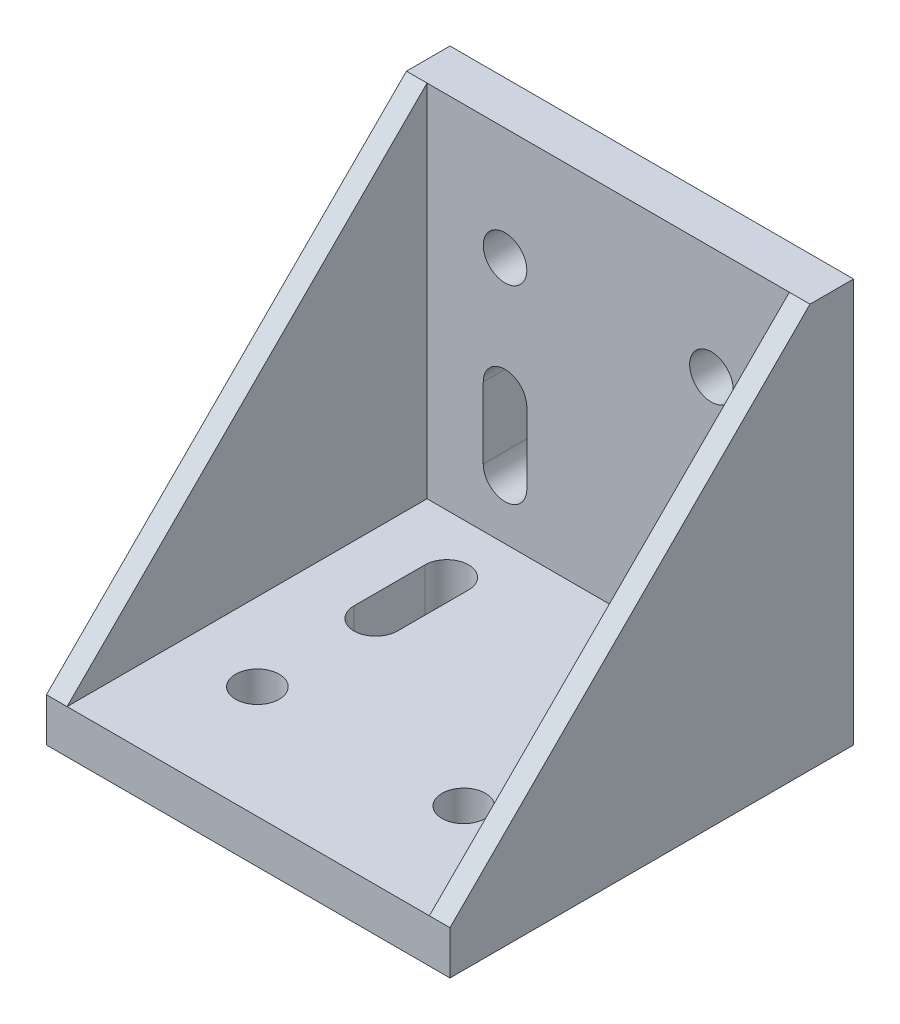
ISO-10303-21;
HEADER;
FILE_DESCRIPTION(('STEP AP214'),'2;1');
FILE_NAME('part.step','',(''),(''),'','','');
FILE_SCHEMA(('AUTOMOTIVE_DESIGN { 1 0 10303 214 1 1 1 1 }'));
ENDSEC;
DATA;
#1=APPLICATION_CONTEXT('core data for automotive mechanical design processes');
#2=APPLICATION_PROTOCOL_DEFINITION('international standard','automotive_design',2000,#1);
#3=PRODUCT_CONTEXT('',#1,'mechanical');
#4=PRODUCT('Part','Part','',(#3));
#5=PRODUCT_RELATED_PRODUCT_CATEGORY('part','',(#4));
#6=PRODUCT_DEFINITION_FORMATION('','',#4);
#7=PRODUCT_DEFINITION_CONTEXT('part definition',#1,'design');
#8=PRODUCT_DEFINITION('design','',#6,#7);
#9=PRODUCT_DEFINITION_SHAPE('','',#8);
#10=(LENGTH_UNIT() NAMED_UNIT(*) SI_UNIT(.MILLI.,.METRE.));
#11=(NAMED_UNIT(*) PLANE_ANGLE_UNIT() SI_UNIT($,.RADIAN.));
#12=(NAMED_UNIT(*) SI_UNIT($,.STERADIAN.) SOLID_ANGLE_UNIT());
#13=UNCERTAINTY_MEASURE_WITH_UNIT(LENGTH_MEASURE(1.E-05),#10,'distance_accuracy_value','');
#14=(GEOMETRIC_REPRESENTATION_CONTEXT(3) GLOBAL_UNCERTAINTY_ASSIGNED_CONTEXT((#13)) GLOBAL_UNIT_ASSIGNED_CONTEXT((#10,
#11,#12)) REPRESENTATION_CONTEXT('',''));
#15=CARTESIAN_POINT('',(0.,0.,0.));
#16=DIRECTION('',(0.,0.,1.));
#17=DIRECTION('',(1.,0.,0.));
#18=AXIS2_PLACEMENT_3D('',#15,#16,#17);
#19=CARTESIAN_POINT('',(44.,-44.,9.5));
#20=DIRECTION('',(0.,0.,1.));
#21=DIRECTION('',(1.,0.,0.));
#22=AXIS2_PLACEMENT_3D('',#19,#20,#21);
#23=PLANE('',#22);
#24=DIRECTION('',(0.,1.,0.));
#25=VECTOR('',#24,1.);
#26=CARTESIAN_POINT('',(-27.25,-6.30000000000004,9.50000000000002));
#27=LINE('',#26,#25);
#28=CARTESIAN_POINT('',(-27.25,-21.8,9.50000000000002));
#29=VERTEX_POINT('',#28);
#30=CARTESIAN_POINT('',(-27.25,-6.30000000000004,9.5));
#31=VERTEX_POINT('',#30);
#32=EDGE_CURVE('E224',#29,#31,#27,.T.);
#33=ORIENTED_EDGE('',*,*,#32,.T.);
#34=CARTESIAN_POINT('',(-22.5,-6.30000000000004,9.50000000000002));
#35=DIRECTION('',(0.,0.,-1.));
#36=DIRECTION('',(0.,-1.,0.));
#37=AXIS2_PLACEMENT_3D('',#34,#35,#36);
#38=CIRCLE('',#37,4.75);
#39=CARTESIAN_POINT('',(-17.75,-6.30000000000003,9.50000000000002));
#40=VERTEX_POINT('',#39);
#41=EDGE_CURVE('E49',#31,#40,#38,.T.);
#42=ORIENTED_EDGE('',*,*,#41,.T.);
#43=DIRECTION('',(0.,-1.,0.));
#44=VECTOR('',#43,1.);
#45=CARTESIAN_POINT('',(-17.75,-6.30000000000003,9.50000000000002));
#46=LINE('',#45,#44);
#47=CARTESIAN_POINT('',(-17.75,-21.8,9.50000000000002));
#48=VERTEX_POINT('',#47);
#49=EDGE_CURVE('E212',#40,#48,#46,.T.);
#50=ORIENTED_EDGE('',*,*,#49,.T.);
#51=CARTESIAN_POINT('',(-22.5,-21.8,9.50000000000002));
#52=DIRECTION('',(0.,0.,-1.));
#53=DIRECTION('',(0.,-1.,0.));
#54=AXIS2_PLACEMENT_3D('',#51,#52,#53);
#55=CIRCLE('',#54,4.75);
#56=EDGE_CURVE('E215',#48,#29,#55,.T.);
#57=ORIENTED_EDGE('',*,*,#56,.T.);
#58=EDGE_LOOP('',(#33,#42,#50,#57));
#59=FACE_BOUND('',#58,.T.);
#60=CARTESIAN_POINT('',(22.5,19.5,9.50000000000003));
#61=DIRECTION('',(0.,0.,-1.));
#62=DIRECTION('',(0.,1.,0.));
#63=AXIS2_PLACEMENT_3D('',#60,#61,#62);
#64=CIRCLE('',#63,4.75000000000001);
#65=CARTESIAN_POINT('',(22.5,24.25,9.50000000000003));
#66=VERTEX_POINT('',#65);
#67=EDGE_CURVE('E259',#66,#66,#64,.T.);
#68=ORIENTED_EDGE('',*,*,#67,.T.);
#69=EDGE_LOOP('',(#68));
#70=FACE_BOUND('',#69,.T.);
#71=DIRECTION('',(-1.,0.,0.));
#72=VECTOR('',#71,1.);
#73=CARTESIAN_POINT('',(44.,-34.5,9.5));
#74=LINE('',#73,#72);
#75=CARTESIAN_POINT('',(39.5,-34.5,9.5));
#76=VERTEX_POINT('',#75);
#77=CARTESIAN_POINT('',(-39.5,-34.5,9.5));
#78=VERTEX_POINT('',#77);
#79=EDGE_CURVE('E389',#76,#78,#74,.T.);
#80=ORIENTED_EDGE('',*,*,#79,.F.);
#81=DIRECTION('',(0.,-1.,0.));
#82=VECTOR('',#81,1.);
#83=CARTESIAN_POINT('',(39.5,-34.5,9.5));
#84=LINE('',#83,#82);
#85=CARTESIAN_POINT('',(39.5,44.,9.5));
#86=VERTEX_POINT('',#85);
#87=EDGE_CURVE('E348',#86,#76,#84,.T.);
#88=ORIENTED_EDGE('',*,*,#87,.F.);
#89=DIRECTION('',(-1.,0.,0.));
#90=VECTOR('',#89,1.);
#91=CARTESIAN_POINT('',(-44.,44.,9.5));
#92=LINE('',#91,#90);
#93=CARTESIAN_POINT('',(-39.5,44.,9.5));
#94=VERTEX_POINT('',#93);
#95=EDGE_CURVE('E396',#86,#94,#92,.T.);
#96=ORIENTED_EDGE('',*,*,#95,.T.);
#97=DIRECTION('',(0.,-1.,0.));
#98=VECTOR('',#97,1.);
#99=CARTESIAN_POINT('',(-39.5,-34.5,9.5));
#100=LINE('',#99,#98);
#101=EDGE_CURVE('E363',#94,#78,#100,.T.);
#102=ORIENTED_EDGE('',*,*,#101,.T.);
#103=EDGE_LOOP('',(#80,#88,#96,#102));
#104=FACE_BOUND('',#103,.T.);
#105=DIRECTION('',(0.,1.,0.));
#106=VECTOR('',#105,1.);
#107=CARTESIAN_POINT('',(17.75,-6.30000000000003,9.50000000000002));
#108=LINE('',#107,#106);
#109=CARTESIAN_POINT('',(17.75,-21.8,9.50000000000002));
#110=VERTEX_POINT('',#109);
#111=CARTESIAN_POINT('',(17.75,-6.30000000000003,9.5));
#112=VERTEX_POINT('',#111);
#113=EDGE_CURVE('E248',#110,#112,#108,.T.);
#114=ORIENTED_EDGE('',*,*,#113,.T.);
#115=CARTESIAN_POINT('',(22.5,-6.30000000000003,9.50000000000002));
#116=DIRECTION('',(0.,0.,-1.));
#117=DIRECTION('',(0.,1.,0.));
#118=AXIS2_PLACEMENT_3D('',#115,#116,#117);
#119=CIRCLE('',#118,4.75);
#120=CARTESIAN_POINT('',(27.25,-6.30000000000003,9.50000000000002));
#121=VERTEX_POINT('',#120);
#122=EDGE_CURVE('E231',#112,#121,#119,.T.);
#123=ORIENTED_EDGE('',*,*,#122,.T.);
#124=DIRECTION('',(0.,-1.,0.));
#125=VECTOR('',#124,1.);
#126=CARTESIAN_POINT('',(27.25,-6.30000000000003,9.50000000000002));
#127=LINE('',#126,#125);
#128=CARTESIAN_POINT('',(27.25,-21.8,9.50000000000002));
#129=VERTEX_POINT('',#128);
#130=EDGE_CURVE('E238',#121,#129,#127,.T.);
#131=ORIENTED_EDGE('',*,*,#130,.T.);
#132=CARTESIAN_POINT('',(22.5,-21.8,9.50000000000002));
#133=DIRECTION('',(0.,0.,-1.));
#134=DIRECTION('',(0.,1.,0.));
#135=AXIS2_PLACEMENT_3D('',#132,#133,#134);
#136=CIRCLE('',#135,4.75);
#137=EDGE_CURVE('E251',#129,#110,#136,.T.);
#138=ORIENTED_EDGE('',*,*,#137,.T.);
#139=EDGE_LOOP('',(#114,#123,#131,#138));
#140=FACE_BOUND('',#139,.T.);
#141=CARTESIAN_POINT('',(-22.5,19.5,9.50000000000003));
#142=DIRECTION('',(0.,0.,-1.));
#143=DIRECTION('',(0.,-1.,0.));
#144=AXIS2_PLACEMENT_3D('',#141,#142,#143);
#145=CIRCLE('',#144,4.75000000000001);
#146=CARTESIAN_POINT('',(-22.5,14.75,9.50000000000003));
#147=VERTEX_POINT('',#146);
#148=EDGE_CURVE('E218',#147,#147,#145,.T.);
#149=ORIENTED_EDGE('',*,*,#148,.T.);
#150=EDGE_LOOP('',(#149));
#151=FACE_BOUND('',#150,.T.);
#152=ADVANCED_FACE('F34',(#59,#70,#104,#140,#151),#23,.T.);
#153=CARTESIAN_POINT('',(44.,-44.,0.));
#154=DIRECTION('',(0.,0.,1.));
#155=DIRECTION('',(1.,0.,0.));
#156=AXIS2_PLACEMENT_3D('',#153,#154,#155);
#157=PLANE('',#156);
#158=CARTESIAN_POINT('',(-22.5,-6.30000000000004,0.));
#159=DIRECTION('',(0.,0.,-1.));
#160=DIRECTION('',(0.,-1.,0.));
#161=AXIS2_PLACEMENT_3D('',#158,#159,#160);
#162=CIRCLE('',#161,4.75);
#163=CARTESIAN_POINT('',(-27.25,-6.30000000000004,0.));
#164=VERTEX_POINT('',#163);
#165=CARTESIAN_POINT('',(-17.75,-6.30000000000002,0.));
#166=VERTEX_POINT('',#165);
#167=EDGE_CURVE('E203',#164,#166,#162,.T.);
#168=ORIENTED_EDGE('',*,*,#167,.F.);
#169=DIRECTION('',(0.,1.,0.));
#170=VECTOR('',#169,1.);
#171=CARTESIAN_POINT('',(-27.25,-6.30000000000004,0.));
#172=LINE('',#171,#170);
#173=CARTESIAN_POINT('',(-27.25,-21.8,0.));
#174=VERTEX_POINT('',#173);
#175=EDGE_CURVE('E195',#174,#164,#172,.T.);
#176=ORIENTED_EDGE('',*,*,#175,.F.);
#177=CARTESIAN_POINT('',(-22.5,-21.8,0.));
#178=DIRECTION('',(0.,0.,-1.));
#179=DIRECTION('',(0.,-1.,0.));
#180=AXIS2_PLACEMENT_3D('',#177,#178,#179);
#181=CIRCLE('',#180,4.75);
#182=CARTESIAN_POINT('',(-17.75,-21.8,0.));
#183=VERTEX_POINT('',#182);
#184=EDGE_CURVE('E202',#183,#174,#181,.T.);
#185=ORIENTED_EDGE('',*,*,#184,.F.);
#186=DIRECTION('',(0.,-1.,0.));
#187=VECTOR('',#186,1.);
#188=CARTESIAN_POINT('',(-17.75,-6.30000000000002,0.));
#189=LINE('',#188,#187);
#190=EDGE_CURVE('E207',#166,#183,#189,.T.);
#191=ORIENTED_EDGE('',*,*,#190,.F.);
#192=EDGE_LOOP('',(#168,#176,#185,#191));
#193=FACE_BOUND('',#192,.T.);
#194=CARTESIAN_POINT('',(22.5,19.5,0.));
#195=DIRECTION('',(0.,0.,-1.));
#196=DIRECTION('',(0.,1.,0.));
#197=AXIS2_PLACEMENT_3D('',#194,#195,#196);
#198=CIRCLE('',#197,4.75000000000001);
#199=CARTESIAN_POINT('',(22.5,24.25,0.));
#200=VERTEX_POINT('',#199);
#201=EDGE_CURVE('E266',#200,#200,#198,.T.);
#202=ORIENTED_EDGE('',*,*,#201,.F.);
#203=EDGE_LOOP('',(#202));
#204=FACE_BOUND('',#203,.T.);
#205=DIRECTION('',(-1.,0.,0.));
#206=VECTOR('',#205,1.);
#207=CARTESIAN_POINT('',(-44.,44.,0.));
#208=LINE('',#207,#206);
#209=CARTESIAN_POINT('',(44.,44.,0.));
#210=VERTEX_POINT('',#209);
#211=CARTESIAN_POINT('',(-44.,44.,0.));
#212=VERTEX_POINT('',#211);
#213=EDGE_CURVE('E398',#210,#212,#208,.T.);
#214=ORIENTED_EDGE('',*,*,#213,.F.);
#215=DIRECTION('',(0.,1.,0.));
#216=VECTOR('',#215,1.);
#217=CARTESIAN_POINT('',(44.,44.,0.));
#218=LINE('',#217,#216);
#219=CARTESIAN_POINT('',(44.,-44.,0.));
#220=VERTEX_POINT('',#219);
#221=EDGE_CURVE('E391',#220,#210,#218,.T.);
#222=ORIENTED_EDGE('',*,*,#221,.F.);
#223=DIRECTION('',(1.,0.,0.));
#224=VECTOR('',#223,1.);
#225=CARTESIAN_POINT('',(-44.,-44.,0.));
#226=LINE('',#225,#224);
#227=CARTESIAN_POINT('',(-44.,-44.,0.));
#228=VERTEX_POINT('',#227);
#229=EDGE_CURVE('E402',#228,#220,#226,.T.);
#230=ORIENTED_EDGE('',*,*,#229,.F.);
#231=DIRECTION('',(0.,-1.,0.));
#232=VECTOR('',#231,1.);
#233=CARTESIAN_POINT('',(-44.,44.,0.));
#234=LINE('',#233,#232);
#235=EDGE_CURVE('E400',#212,#228,#234,.T.);
#236=ORIENTED_EDGE('',*,*,#235,.F.);
#237=EDGE_LOOP('',(#214,#222,#230,#236));
#238=FACE_BOUND('',#237,.T.);
#239=CARTESIAN_POINT('',(22.5,-6.30000000000002,0.));
#240=DIRECTION('',(0.,0.,-1.));
#241=DIRECTION('',(0.,1.,0.));
#242=AXIS2_PLACEMENT_3D('',#239,#240,#241);
#243=CIRCLE('',#242,4.75);
#244=CARTESIAN_POINT('',(17.75,-6.30000000000002,0.));
#245=VERTEX_POINT('',#244);
#246=CARTESIAN_POINT('',(27.25,-6.30000000000002,0.));
#247=VERTEX_POINT('',#246);
#248=EDGE_CURVE('E235',#245,#247,#243,.T.);
#249=ORIENTED_EDGE('',*,*,#248,.F.);
#250=DIRECTION('',(0.,1.,0.));
#251=VECTOR('',#250,1.);
#252=CARTESIAN_POINT('',(17.75,-6.30000000000002,0.));
#253=LINE('',#252,#251);
#254=CARTESIAN_POINT('',(17.75,-21.8,0.));
#255=VERTEX_POINT('',#254);
#256=EDGE_CURVE('E237',#255,#245,#253,.T.);
#257=ORIENTED_EDGE('',*,*,#256,.F.);
#258=CARTESIAN_POINT('',(22.5,-21.8,0.));
#259=DIRECTION('',(0.,0.,-1.));
#260=DIRECTION('',(0.,1.,0.));
#261=AXIS2_PLACEMENT_3D('',#258,#259,#260);
#262=CIRCLE('',#261,4.75);
#263=CARTESIAN_POINT('',(27.25,-21.8,0.));
#264=VERTEX_POINT('',#263);
#265=EDGE_CURVE('E240',#264,#255,#262,.T.);
#266=ORIENTED_EDGE('',*,*,#265,.F.);
#267=DIRECTION('',(0.,-1.,0.));
#268=VECTOR('',#267,1.);
#269=CARTESIAN_POINT('',(27.25,-6.30000000000002,0.));
#270=LINE('',#269,#268);
#271=EDGE_CURVE('E243',#247,#264,#270,.T.);
#272=ORIENTED_EDGE('',*,*,#271,.F.);
#273=EDGE_LOOP('',(#249,#257,#266,#272));
#274=FACE_BOUND('',#273,.T.);
#275=CARTESIAN_POINT('',(-22.5,19.5,0.));
#276=DIRECTION('',(0.,0.,-1.));
#277=DIRECTION('',(0.,-1.,0.));
#278=AXIS2_PLACEMENT_3D('',#275,#276,#277);
#279=CIRCLE('',#278,4.75000000000001);
#280=CARTESIAN_POINT('',(-22.5,14.75,0.));
#281=VERTEX_POINT('',#280);
#282=EDGE_CURVE('E225',#281,#281,#279,.T.);
#283=ORIENTED_EDGE('',*,*,#282,.F.);
#284=EDGE_LOOP('',(#283));
#285=FACE_BOUND('',#284,.T.);
#286=ADVANCED_FACE('F210',(#193,#204,#238,#274,#285),#157,.F.);
#287=CARTESIAN_POINT('',(44.,-34.5,88.));
#288=DIRECTION('',(0.,1.,0.));
#289=DIRECTION('',(0.,0.,1.));
#290=AXIS2_PLACEMENT_3D('',#287,#288,#289);
#291=PLANE('',#290);
#292=CARTESIAN_POINT('',(-22.5,-34.5,63.5));
#293=DIRECTION('',(0.,1.,0.));
#294=DIRECTION('',(0.,0.,-1.));
#295=AXIS2_PLACEMENT_3D('',#292,#293,#294);
#296=CIRCLE('',#295,4.75000000000001);
#297=CARTESIAN_POINT('',(-22.5,-34.5,58.75));
#298=VERTEX_POINT('',#297);
#299=EDGE_CURVE('E269',#298,#298,#296,.T.);
#300=ORIENTED_EDGE('',*,*,#299,.F.);
#301=EDGE_LOOP('',(#300));
#302=FACE_BOUND('',#301,.T.);
#303=CARTESIAN_POINT('',(-22.5,-34.5,37.7));
#304=DIRECTION('',(0.,1.,0.));
#305=DIRECTION('',(0.,0.,-1.));
#306=AXIS2_PLACEMENT_3D('',#303,#304,#305);
#307=CIRCLE('',#306,4.75);
#308=CARTESIAN_POINT('',(-27.25,-34.5,37.7));
#309=VERTEX_POINT('',#308);
#310=CARTESIAN_POINT('',(-17.75,-34.5,37.7));
#311=VERTEX_POINT('',#310);
#312=EDGE_CURVE('E275',#309,#311,#307,.T.);
#313=ORIENTED_EDGE('',*,*,#312,.F.);
#314=DIRECTION('',(0.,0.,1.));
#315=VECTOR('',#314,1.);
#316=CARTESIAN_POINT('',(-27.25,-34.5,37.7));
#317=LINE('',#316,#315);
#318=CARTESIAN_POINT('',(-27.25,-34.5,22.2));
#319=VERTEX_POINT('',#318);
#320=EDGE_CURVE('E282',#319,#309,#317,.T.);
#321=ORIENTED_EDGE('',*,*,#320,.F.);
#322=CARTESIAN_POINT('',(-22.5,-34.5,22.2));
#323=DIRECTION('',(0.,1.,0.));
#324=DIRECTION('',(0.,0.,-1.));
#325=AXIS2_PLACEMENT_3D('',#322,#323,#324);
#326=CIRCLE('',#325,4.75);
#327=CARTESIAN_POINT('',(-17.75,-34.5,22.2));
#328=VERTEX_POINT('',#327);
#329=EDGE_CURVE('E296',#328,#319,#326,.T.);
#330=ORIENTED_EDGE('',*,*,#329,.F.);
#331=DIRECTION('',(0.,0.,-1.));
#332=VECTOR('',#331,1.);
#333=CARTESIAN_POINT('',(-17.75,-34.5,37.7));
#334=LINE('',#333,#332);
#335=EDGE_CURVE('E293',#311,#328,#334,.T.);
#336=ORIENTED_EDGE('',*,*,#335,.F.);
#337=EDGE_LOOP('',(#313,#321,#330,#336));
#338=FACE_BOUND('',#337,.T.);
#339=CARTESIAN_POINT('',(22.5,-34.5,37.7));
#340=DIRECTION('',(0.,1.,0.));
#341=DIRECTION('',(0.,0.,1.));
#342=AXIS2_PLACEMENT_3D('',#339,#340,#341);
#343=CIRCLE('',#342,4.75);
#344=CARTESIAN_POINT('',(17.75,-34.5,37.7));
#345=VERTEX_POINT('',#344);
#346=CARTESIAN_POINT('',(27.25,-34.5,37.7));
#347=VERTEX_POINT('',#346);
#348=EDGE_CURVE('E303',#345,#347,#343,.T.);
#349=ORIENTED_EDGE('',*,*,#348,.F.);
#350=DIRECTION('',(0.,0.,1.));
#351=VECTOR('',#350,1.);
#352=CARTESIAN_POINT('',(17.75,-34.5,37.7));
#353=LINE('',#352,#351);
#354=CARTESIAN_POINT('',(17.75,-34.5,22.2));
#355=VERTEX_POINT('',#354);
#356=EDGE_CURVE('E314',#355,#345,#353,.T.);
#357=ORIENTED_EDGE('',*,*,#356,.F.);
#358=CARTESIAN_POINT('',(22.5,-34.5,22.2));
#359=DIRECTION('',(0.,1.,0.));
#360=DIRECTION('',(0.,0.,1.));
#361=AXIS2_PLACEMENT_3D('',#358,#359,#360);
#362=CIRCLE('',#361,4.75);
#363=CARTESIAN_POINT('',(27.25,-34.5,22.2));
#364=VERTEX_POINT('',#363);
#365=EDGE_CURVE('E328',#364,#355,#362,.T.);
#366=ORIENTED_EDGE('',*,*,#365,.F.);
#367=DIRECTION('',(0.,0.,-1.));
#368=VECTOR('',#367,1.);
#369=CARTESIAN_POINT('',(27.25,-34.5,37.7));
#370=LINE('',#369,#368);
#371=EDGE_CURVE('E325',#347,#364,#370,.T.);
#372=ORIENTED_EDGE('',*,*,#371,.F.);
#373=EDGE_LOOP('',(#349,#357,#366,#372));
#374=FACE_BOUND('',#373,.T.);
#375=CARTESIAN_POINT('',(22.5,-34.5,63.5));
#376=DIRECTION('',(0.,1.,0.));
#377=DIRECTION('',(0.,0.,1.));
#378=AXIS2_PLACEMENT_3D('',#375,#376,#377);
#379=CIRCLE('',#378,4.75000000000001);
#380=CARTESIAN_POINT('',(22.5,-34.5,68.25));
#381=VERTEX_POINT('',#380);
#382=EDGE_CURVE('E335',#381,#381,#379,.T.);
#383=ORIENTED_EDGE('',*,*,#382,.F.);
#384=EDGE_LOOP('',(#383));
#385=FACE_BOUND('',#384,.T.);
#386=DIRECTION('',(1.,0.,0.));
#387=VECTOR('',#386,1.);
#388=CARTESIAN_POINT('',(44.,-34.5,88.));
#389=LINE('',#388,#387);
#390=CARTESIAN_POINT('',(-39.5,-34.5,88.));
#391=VERTEX_POINT('',#390);
#392=CARTESIAN_POINT('',(39.5,-34.5,88.));
#393=VERTEX_POINT('',#392);
#394=EDGE_CURVE('E385',#391,#393,#389,.T.);
#395=ORIENTED_EDGE('',*,*,#394,.T.);
#396=DIRECTION('',(0.,0.,1.));
#397=VECTOR('',#396,1.);
#398=CARTESIAN_POINT('',(39.5,-34.5,88.));
#399=LINE('',#398,#397);
#400=EDGE_CURVE('E354',#76,#393,#399,.T.);
#401=ORIENTED_EDGE('',*,*,#400,.F.);
#402=ORIENTED_EDGE('',*,*,#79,.T.);
#403=DIRECTION('',(0.,0.,1.));
#404=VECTOR('',#403,1.);
#405=CARTESIAN_POINT('',(-39.5,-34.5,88.));
#406=LINE('',#405,#404);
#407=EDGE_CURVE('E366',#78,#391,#406,.T.);
#408=ORIENTED_EDGE('',*,*,#407,.T.);
#409=EDGE_LOOP('',(#395,#401,#402,#408));
#410=FACE_BOUND('',#409,.T.);
#411=ADVANCED_FACE('F437',(#302,#338,#374,#385,#410),#291,.T.);
#412=CARTESIAN_POINT('',(44.,44.,9.5));
#413=DIRECTION('',(-1.,0.,0.));
#414=DIRECTION('',(0.,-1.,0.));
#415=AXIS2_PLACEMENT_3D('',#412,#413,#414);
#416=PLANE('',#415);
#417=DIRECTION('',(0.,0.,-1.));
#418=VECTOR('',#417,1.);
#419=CARTESIAN_POINT('',(44.,44.,9.5));
#420=LINE('',#419,#418);
#421=CARTESIAN_POINT('',(44.,44.,9.5));
#422=VERTEX_POINT('',#421);
#423=EDGE_CURVE('E11',#422,#210,#420,.T.);
#424=ORIENTED_EDGE('',*,*,#423,.F.);
#425=DIRECTION('',(0.,0.707106781186547,-0.707106781186547));
#426=VECTOR('',#425,1.);
#427=CARTESIAN_POINT('',(44.,44.,9.5));
#428=LINE('',#427,#426);
#429=CARTESIAN_POINT('',(44.,-34.5,88.));
#430=VERTEX_POINT('',#429);
#431=EDGE_CURVE('E345',#430,#422,#428,.T.);
#432=ORIENTED_EDGE('',*,*,#431,.F.);
#433=DIRECTION('',(0.,-1.,0.));
#434=VECTOR('',#433,1.);
#435=CARTESIAN_POINT('',(44.,-44.,88.));
#436=LINE('',#435,#434);
#437=CARTESIAN_POINT('',(44.,-44.,88.));
#438=VERTEX_POINT('',#437);
#439=EDGE_CURVE('E377',#430,#438,#436,.T.);
#440=ORIENTED_EDGE('',*,*,#439,.T.);
#441=DIRECTION('',(0.,0.,-1.));
#442=VECTOR('',#441,1.);
#443=CARTESIAN_POINT('',(44.,-44.,9.5));
#444=LINE('',#443,#442);
#445=EDGE_CURVE('E395',#438,#220,#444,.T.);
#446=ORIENTED_EDGE('',*,*,#445,.T.);
#447=ORIENTED_EDGE('',*,*,#221,.T.);
#448=EDGE_LOOP('',(#424,#432,#440,#446,#447));
#449=FACE_BOUND('',#448,.T.);
#450=ADVANCED_FACE('F36',(#449),#416,.F.);
#451=CARTESIAN_POINT('',(-44.,44.,9.5));
#452=DIRECTION('',(0.,-1.,0.));
#453=DIRECTION('',(0.,0.,-1.));
#454=AXIS2_PLACEMENT_3D('',#451,#452,#453);
#455=PLANE('',#454);
#456=ORIENTED_EDGE('',*,*,#213,.T.);
#457=DIRECTION('',(0.,0.,-1.));
#458=VECTOR('',#457,1.);
#459=CARTESIAN_POINT('',(-44.,44.,9.5));
#460=LINE('',#459,#458);
#461=CARTESIAN_POINT('',(-44.,44.,9.5));
#462=VERTEX_POINT('',#461);
#463=EDGE_CURVE('E42',#462,#212,#460,.T.);
#464=ORIENTED_EDGE('',*,*,#463,.F.);
#465=DIRECTION('',(-1.,0.,0.));
#466=VECTOR('',#465,1.);
#467=CARTESIAN_POINT('',(-39.5,44.,9.5));
#468=LINE('',#467,#466);
#469=EDGE_CURVE('E372',#94,#462,#468,.T.);
#470=ORIENTED_EDGE('',*,*,#469,.F.);
#471=ORIENTED_EDGE('',*,*,#95,.F.);
#472=EDGE_CURVE('E392',#422,#86,#92,.T.);
#473=ORIENTED_EDGE('',*,*,#472,.F.);
#474=ORIENTED_EDGE('',*,*,#423,.T.);
#475=EDGE_LOOP('',(#456,#464,#470,#471,#473,#474));
#476=FACE_BOUND('',#475,.T.);
#477=ADVANCED_FACE('F449',(#476),#455,.F.);
#478=CARTESIAN_POINT('',(-44.,44.,9.5));
#479=DIRECTION('',(1.,0.,0.));
#480=DIRECTION('',(0.,1.,0.));
#481=AXIS2_PLACEMENT_3D('',#478,#479,#480);
#482=PLANE('',#481);
#483=ORIENTED_EDGE('',*,*,#235,.T.);
#484=DIRECTION('',(0.,0.,-1.));
#485=VECTOR('',#484,1.);
#486=CARTESIAN_POINT('',(-44.,-44.,9.5));
#487=LINE('',#486,#485);
#488=CARTESIAN_POINT('',(-44.,-44.,88.));
#489=VERTEX_POINT('',#488);
#490=EDGE_CURVE('E406',#489,#228,#487,.T.);
#491=ORIENTED_EDGE('',*,*,#490,.F.);
#492=DIRECTION('',(0.,1.,0.));
#493=VECTOR('',#492,1.);
#494=CARTESIAN_POINT('',(-44.,-44.,88.));
#495=LINE('',#494,#493);
#496=CARTESIAN_POINT('',(-44.,-34.5,88.));
#497=VERTEX_POINT('',#496);
#498=EDGE_CURVE('E383',#489,#497,#495,.T.);
#499=ORIENTED_EDGE('',*,*,#498,.T.);
#500=DIRECTION('',(0.,0.707106781186547,-0.707106781186547));
#501=VECTOR('',#500,1.);
#502=CARTESIAN_POINT('',(-44.,44.,9.5));
#503=LINE('',#502,#501);
#504=EDGE_CURVE('E362',#497,#462,#503,.T.);
#505=ORIENTED_EDGE('',*,*,#504,.T.);
#506=ORIENTED_EDGE('',*,*,#463,.T.);
#507=EDGE_LOOP('',(#483,#491,#499,#505,#506));
#508=FACE_BOUND('',#507,.T.);
#509=ADVANCED_FACE('F411',(#508),#482,.F.);
#510=CARTESIAN_POINT('',(-44.,-44.,9.5));
#511=DIRECTION('',(0.,1.,0.));
#512=DIRECTION('',(0.,0.,1.));
#513=AXIS2_PLACEMENT_3D('',#510,#511,#512);
#514=PLANE('',#513);
#515=CARTESIAN_POINT('',(-22.5,-44.,63.5));
#516=DIRECTION('',(0.,1.,0.));
#517=DIRECTION('',(0.,0.,-1.));
#518=AXIS2_PLACEMENT_3D('',#515,#516,#517);
#519=CIRCLE('',#518,4.75000000000001);
#520=CARTESIAN_POINT('',(-22.5,-44.,58.75));
#521=VERTEX_POINT('',#520);
#522=EDGE_CURVE('E272',#521,#521,#519,.T.);
#523=ORIENTED_EDGE('',*,*,#522,.T.);
#524=EDGE_LOOP('',(#523));
#525=FACE_BOUND('',#524,.T.);
#526=DIRECTION('',(0.,0.,1.));
#527=VECTOR('',#526,1.);
#528=CARTESIAN_POINT('',(-27.25,-44.,37.7));
#529=LINE('',#528,#527);
#530=CARTESIAN_POINT('',(-27.25,-44.,22.2));
#531=VERTEX_POINT('',#530);
#532=CARTESIAN_POINT('',(-27.25,-44.,37.7));
#533=VERTEX_POINT('',#532);
#534=EDGE_CURVE('E288',#531,#533,#529,.T.);
#535=ORIENTED_EDGE('',*,*,#534,.T.);
#536=CARTESIAN_POINT('',(-22.5,-44.,37.7));
#537=DIRECTION('',(0.,1.,0.));
#538=DIRECTION('',(0.,0.,-1.));
#539=AXIS2_PLACEMENT_3D('',#536,#537,#538);
#540=CIRCLE('',#539,4.75);
#541=CARTESIAN_POINT('',(-17.75,-44.,37.7));
#542=VERTEX_POINT('',#541);
#543=EDGE_CURVE('E278',#533,#542,#540,.T.);
#544=ORIENTED_EDGE('',*,*,#543,.T.);
#545=DIRECTION('',(0.,0.,-1.));
#546=VECTOR('',#545,1.);
#547=CARTESIAN_POINT('',(-17.75,-44.,37.7));
#548=LINE('',#547,#546);
#549=CARTESIAN_POINT('',(-17.75,-44.,22.2));
#550=VERTEX_POINT('',#549);
#551=EDGE_CURVE('E281',#542,#550,#548,.T.);
#552=ORIENTED_EDGE('',*,*,#551,.T.);
#553=CARTESIAN_POINT('',(-22.5,-44.,22.2));
#554=DIRECTION('',(0.,1.,0.));
#555=DIRECTION('',(0.,0.,-1.));
#556=AXIS2_PLACEMENT_3D('',#553,#554,#555);
#557=CIRCLE('',#556,4.75);
#558=EDGE_CURVE('E285',#550,#531,#557,.T.);
#559=ORIENTED_EDGE('',*,*,#558,.T.);
#560=EDGE_LOOP('',(#535,#544,#552,#559));
#561=FACE_BOUND('',#560,.T.);
#562=DIRECTION('',(0.,0.,1.));
#563=VECTOR('',#562,1.);
#564=CARTESIAN_POINT('',(17.75,-44.,37.7));
#565=LINE('',#564,#563);
#566=CARTESIAN_POINT('',(17.75,-44.,22.2));
#567=VERTEX_POINT('',#566);
#568=CARTESIAN_POINT('',(17.75,-44.,37.7));
#569=VERTEX_POINT('',#568);
#570=EDGE_CURVE('E320',#567,#569,#565,.T.);
#571=ORIENTED_EDGE('',*,*,#570,.T.);
#572=CARTESIAN_POINT('',(22.5,-44.,37.7));
#573=DIRECTION('',(0.,1.,0.));
#574=DIRECTION('',(0.,0.,1.));
#575=AXIS2_PLACEMENT_3D('',#572,#573,#574);
#576=CIRCLE('',#575,4.75);
#577=CARTESIAN_POINT('',(27.25,-44.,37.7));
#578=VERTEX_POINT('',#577);
#579=EDGE_CURVE('E310',#569,#578,#576,.T.);
#580=ORIENTED_EDGE('',*,*,#579,.T.);
#581=DIRECTION('',(0.,0.,-1.));
#582=VECTOR('',#581,1.);
#583=CARTESIAN_POINT('',(27.25,-44.,37.7));
#584=LINE('',#583,#582);
#585=CARTESIAN_POINT('',(27.25,-44.,22.2));
#586=VERTEX_POINT('',#585);
#587=EDGE_CURVE('E313',#578,#586,#584,.T.);
#588=ORIENTED_EDGE('',*,*,#587,.T.);
#589=CARTESIAN_POINT('',(22.5,-44.,22.2));
#590=DIRECTION('',(0.,1.,0.));
#591=DIRECTION('',(0.,0.,1.));
#592=AXIS2_PLACEMENT_3D('',#589,#590,#591);
#593=CIRCLE('',#592,4.75);
#594=EDGE_CURVE('E317',#586,#567,#593,.T.);
#595=ORIENTED_EDGE('',*,*,#594,.T.);
#596=EDGE_LOOP('',(#571,#580,#588,#595));
#597=FACE_BOUND('',#596,.T.);
#598=CARTESIAN_POINT('',(22.5,-44.,63.5));
#599=DIRECTION('',(0.,1.,0.));
#600=DIRECTION('',(0.,0.,1.));
#601=AXIS2_PLACEMENT_3D('',#598,#599,#600);
#602=CIRCLE('',#601,4.75000000000001);
#603=CARTESIAN_POINT('',(22.5,-44.,68.25));
#604=VERTEX_POINT('',#603);
#605=EDGE_CURVE('E342',#604,#604,#602,.T.);
#606=ORIENTED_EDGE('',*,*,#605,.T.);
#607=EDGE_LOOP('',(#606));
#608=FACE_BOUND('',#607,.T.);
#609=ORIENTED_EDGE('',*,*,#229,.T.);
#610=ORIENTED_EDGE('',*,*,#445,.F.);
#611=DIRECTION('',(-1.,0.,0.));
#612=VECTOR('',#611,1.);
#613=CARTESIAN_POINT('',(44.,-44.,88.));
#614=LINE('',#613,#612);
#615=EDGE_CURVE('E380',#438,#489,#614,.T.);
#616=ORIENTED_EDGE('',*,*,#615,.T.);
#617=ORIENTED_EDGE('',*,*,#490,.T.);
#618=EDGE_LOOP('',(#609,#610,#616,#617));
#619=FACE_BOUND('',#618,.T.);
#620=ADVANCED_FACE('F421',(#525,#561,#597,#608,#619),#514,.F.);
#621=CARTESIAN_POINT('',(44.,-34.5,88.));
#622=DIRECTION('',(0.,0.,1.));
#623=DIRECTION('',(1.,0.,0.));
#624=AXIS2_PLACEMENT_3D('',#621,#622,#623);
#625=PLANE('',#624);
#626=ORIENTED_EDGE('',*,*,#439,.F.);
#627=DIRECTION('',(1.,0.,0.));
#628=VECTOR('',#627,1.);
#629=CARTESIAN_POINT('',(39.5,-34.5,88.));
#630=LINE('',#629,#628);
#631=EDGE_CURVE('E357',#393,#430,#630,.T.);
#632=ORIENTED_EDGE('',*,*,#631,.F.);
#633=ORIENTED_EDGE('',*,*,#394,.F.);
#634=EDGE_CURVE('E386',#497,#391,#389,.T.);
#635=ORIENTED_EDGE('',*,*,#634,.F.);
#636=ORIENTED_EDGE('',*,*,#498,.F.);
#637=ORIENTED_EDGE('',*,*,#615,.F.);
#638=EDGE_LOOP('',(#626,#632,#633,#635,#636,#637));
#639=FACE_BOUND('',#638,.T.);
#640=ADVANCED_FACE('F427',(#639),#625,.T.);
#641=CARTESIAN_POINT('',(-39.5,44.,9.5));
#642=DIRECTION('',(0.,0.707106781186548,0.707106781186548));
#643=DIRECTION('',(0.,-0.707106781186547,0.707106781186548));
#644=AXIS2_PLACEMENT_3D('',#641,#642,#643);
#645=PLANE('',#644);
#646=ORIENTED_EDGE('',*,*,#504,.F.);
#647=ORIENTED_EDGE('',*,*,#634,.T.);
#648=DIRECTION('',(0.,0.707106781186547,-0.707106781186547));
#649=VECTOR('',#648,1.);
#650=CARTESIAN_POINT('',(-39.5,44.,9.5));
#651=LINE('',#650,#649);
#652=EDGE_CURVE('E369',#391,#94,#651,.T.);
#653=ORIENTED_EDGE('',*,*,#652,.T.);
#654=ORIENTED_EDGE('',*,*,#469,.T.);
#655=EDGE_LOOP('',(#646,#647,#653,#654));
#656=FACE_BOUND('',#655,.T.);
#657=ADVANCED_FACE('F448',(#656),#645,.T.);
#658=CARTESIAN_POINT('',(-39.5,-34.5,9.49999999999999));
#659=DIRECTION('',(-1.,0.,0.));
#660=DIRECTION('',(0.,-1.,0.));
#661=AXIS2_PLACEMENT_3D('',#658,#659,#660);
#662=PLANE('',#661);
#663=ORIENTED_EDGE('',*,*,#101,.F.);
#664=ORIENTED_EDGE('',*,*,#652,.F.);
#665=ORIENTED_EDGE('',*,*,#407,.F.);
#666=EDGE_LOOP('',(#663,#664,#665));
#667=FACE_BOUND('',#666,.T.);
#668=ADVANCED_FACE('F445',(#667),#662,.F.);
#669=CARTESIAN_POINT('',(39.5,44.,9.5));
#670=DIRECTION('',(0.,-0.707106781186548,-0.707106781186548));
#671=DIRECTION('',(0.,0.707106781186547,-0.707106781186548));
#672=AXIS2_PLACEMENT_3D('',#669,#670,#671);
#673=PLANE('',#672);
#674=ORIENTED_EDGE('',*,*,#431,.T.);
#675=ORIENTED_EDGE('',*,*,#472,.T.);
#676=DIRECTION('',(0.,0.707106781186547,-0.707106781186547));
#677=VECTOR('',#676,1.);
#678=CARTESIAN_POINT('',(39.5,44.,9.5));
#679=LINE('',#678,#677);
#680=EDGE_CURVE('E351',#393,#86,#679,.T.);
#681=ORIENTED_EDGE('',*,*,#680,.F.);
#682=ORIENTED_EDGE('',*,*,#631,.T.);
#683=EDGE_LOOP('',(#674,#675,#681,#682));
#684=FACE_BOUND('',#683,.T.);
#685=ADVANCED_FACE('F432',(#684),#673,.F.);
#686=CARTESIAN_POINT('',(39.5,-34.5,9.49999999999999));
#687=DIRECTION('',(1.,0.,0.));
#688=DIRECTION('',(0.,-1.,0.));
#689=AXIS2_PLACEMENT_3D('',#686,#687,#688);
#690=PLANE('',#689);
#691=ORIENTED_EDGE('',*,*,#87,.T.);
#692=ORIENTED_EDGE('',*,*,#400,.T.);
#693=ORIENTED_EDGE('',*,*,#680,.T.);
#694=EDGE_LOOP('',(#691,#692,#693));
#695=FACE_BOUND('',#694,.T.);
#696=ADVANCED_FACE('F434',(#695),#690,.F.);
#697=CARTESIAN_POINT('',(22.5,-44.,63.5));
#698=DIRECTION('',(0.,1.,0.));
#699=DIRECTION('',(0.,0.,1.));
#700=AXIS2_PLACEMENT_3D('',#697,#698,#699);
#701=CYLINDRICAL_SURFACE('',#700,4.75000000000001);
#702=ORIENTED_EDGE('',*,*,#605,.F.);
#703=EDGE_LOOP('',(#702));
#704=FACE_BOUND('',#703,.T.);
#705=ORIENTED_EDGE('',*,*,#382,.T.);
#706=EDGE_LOOP('',(#705));
#707=FACE_BOUND('',#706,.T.);
#708=ADVANCED_FACE('F483',(#704,#707),#701,.F.);
#709=CARTESIAN_POINT('',(22.5,-44.,37.7));
#710=DIRECTION('',(0.,1.,0.));
#711=DIRECTION('',(0.,0.,1.));
#712=AXIS2_PLACEMENT_3D('',#709,#710,#711);
#713=CYLINDRICAL_SURFACE('',#712,4.75);
#714=ORIENTED_EDGE('',*,*,#348,.T.);
#715=DIRECTION('',(0.,1.,0.));
#716=VECTOR('',#715,1.);
#717=CARTESIAN_POINT('',(27.25,-44.,37.7));
#718=LINE('',#717,#716);
#719=EDGE_CURVE('E323',#578,#347,#718,.T.);
#720=ORIENTED_EDGE('',*,*,#719,.F.);
#721=ORIENTED_EDGE('',*,*,#579,.F.);
#722=DIRECTION('',(0.,1.,0.));
#723=VECTOR('',#722,1.);
#724=CARTESIAN_POINT('',(17.75,-44.,37.7));
#725=LINE('',#724,#723);
#726=EDGE_CURVE('E333',#569,#345,#725,.T.);
#727=ORIENTED_EDGE('',*,*,#726,.T.);
#728=EDGE_LOOP('',(#714,#720,#721,#727));
#729=FACE_BOUND('',#728,.T.);
#730=ADVANCED_FACE('F486',(#729),#713,.F.);
#731=CARTESIAN_POINT('',(17.75,-44.,37.7));
#732=DIRECTION('',(-1.,0.,0.));
#733=DIRECTION('',(0.,0.,1.));
#734=AXIS2_PLACEMENT_3D('',#731,#732,#733);
#735=PLANE('',#734);
#736=ORIENTED_EDGE('',*,*,#356,.T.);
#737=ORIENTED_EDGE('',*,*,#726,.F.);
#738=ORIENTED_EDGE('',*,*,#570,.F.);
#739=DIRECTION('',(0.,1.,0.));
#740=VECTOR('',#739,1.);
#741=CARTESIAN_POINT('',(17.75,-44.,22.2));
#742=LINE('',#741,#740);
#743=EDGE_CURVE('E336',#567,#355,#742,.T.);
#744=ORIENTED_EDGE('',*,*,#743,.T.);
#745=EDGE_LOOP('',(#736,#737,#738,#744));
#746=FACE_BOUND('',#745,.T.);
#747=ADVANCED_FACE('F513',(#746),#735,.F.);
#748=CARTESIAN_POINT('',(22.5,-44.,22.2));
#749=DIRECTION('',(0.,1.,0.));
#750=DIRECTION('',(0.,0.,1.));
#751=AXIS2_PLACEMENT_3D('',#748,#749,#750);
#752=CYLINDRICAL_SURFACE('',#751,4.75);
#753=ORIENTED_EDGE('',*,*,#365,.T.);
#754=ORIENTED_EDGE('',*,*,#743,.F.);
#755=ORIENTED_EDGE('',*,*,#594,.F.);
#756=DIRECTION('',(0.,1.,0.));
#757=VECTOR('',#756,1.);
#758=CARTESIAN_POINT('',(27.25,-44.,22.2));
#759=LINE('',#758,#757);
#760=EDGE_CURVE('E338',#586,#364,#759,.T.);
#761=ORIENTED_EDGE('',*,*,#760,.T.);
#762=EDGE_LOOP('',(#753,#754,#755,#761));
#763=FACE_BOUND('',#762,.T.);
#764=ADVANCED_FACE('F511',(#763),#752,.F.);
#765=CARTESIAN_POINT('',(27.25,-44.,37.7));
#766=DIRECTION('',(1.,0.,0.));
#767=DIRECTION('',(0.,0.,-1.));
#768=AXIS2_PLACEMENT_3D('',#765,#766,#767);
#769=PLANE('',#768);
#770=ORIENTED_EDGE('',*,*,#371,.T.);
#771=ORIENTED_EDGE('',*,*,#760,.F.);
#772=ORIENTED_EDGE('',*,*,#587,.F.);
#773=ORIENTED_EDGE('',*,*,#719,.T.);
#774=EDGE_LOOP('',(#770,#771,#772,#773));
#775=FACE_BOUND('',#774,.T.);
#776=ADVANCED_FACE('F508',(#775),#769,.F.);
#777=CARTESIAN_POINT('',(-22.5,-44.,37.7));
#778=DIRECTION('',(0.,1.,0.));
#779=DIRECTION('',(0.,0.,1.));
#780=AXIS2_PLACEMENT_3D('',#777,#778,#779);
#781=CYLINDRICAL_SURFACE('',#780,4.75);
#782=ORIENTED_EDGE('',*,*,#312,.T.);
#783=DIRECTION('',(0.,1.,0.));
#784=VECTOR('',#783,1.);
#785=CARTESIAN_POINT('',(-17.75,-44.,37.7));
#786=LINE('',#785,#784);
#787=EDGE_CURVE('E291',#542,#311,#786,.T.);
#788=ORIENTED_EDGE('',*,*,#787,.F.);
#789=ORIENTED_EDGE('',*,*,#543,.F.);
#790=DIRECTION('',(0.,1.,0.));
#791=VECTOR('',#790,1.);
#792=CARTESIAN_POINT('',(-27.25,-44.,37.7));
#793=LINE('',#792,#791);
#794=EDGE_CURVE('E301',#533,#309,#793,.T.);
#795=ORIENTED_EDGE('',*,*,#794,.T.);
#796=EDGE_LOOP('',(#782,#788,#789,#795));
#797=FACE_BOUND('',#796,.T.);
#798=ADVANCED_FACE('F523',(#797),#781,.F.);
#799=CARTESIAN_POINT('',(-27.25,-44.,37.7));
#800=DIRECTION('',(-1.,0.,0.));
#801=DIRECTION('',(0.,0.,1.));
#802=AXIS2_PLACEMENT_3D('',#799,#800,#801);
#803=PLANE('',#802);
#804=ORIENTED_EDGE('',*,*,#320,.T.);
#805=ORIENTED_EDGE('',*,*,#794,.F.);
#806=ORIENTED_EDGE('',*,*,#534,.F.);
#807=DIRECTION('',(0.,1.,0.));
#808=VECTOR('',#807,1.);
#809=CARTESIAN_POINT('',(-27.25,-44.,22.2));
#810=LINE('',#809,#808);
#811=EDGE_CURVE('E304',#531,#319,#810,.T.);
#812=ORIENTED_EDGE('',*,*,#811,.T.);
#813=EDGE_LOOP('',(#804,#805,#806,#812));
#814=FACE_BOUND('',#813,.T.);
#815=ADVANCED_FACE('F584',(#814),#803,.F.);
#816=CARTESIAN_POINT('',(-22.5,-44.,22.2));
#817=DIRECTION('',(0.,1.,0.));
#818=DIRECTION('',(0.,0.,1.));
#819=AXIS2_PLACEMENT_3D('',#816,#817,#818);
#820=CYLINDRICAL_SURFACE('',#819,4.75);
#821=ORIENTED_EDGE('',*,*,#329,.T.);
#822=ORIENTED_EDGE('',*,*,#811,.F.);
#823=ORIENTED_EDGE('',*,*,#558,.F.);
#824=DIRECTION('',(0.,1.,0.));
#825=VECTOR('',#824,1.);
#826=CARTESIAN_POINT('',(-17.75,-44.,22.2));
#827=LINE('',#826,#825);
#828=EDGE_CURVE('E306',#550,#328,#827,.T.);
#829=ORIENTED_EDGE('',*,*,#828,.T.);
#830=EDGE_LOOP('',(#821,#822,#823,#829));
#831=FACE_BOUND('',#830,.T.);
#832=ADVANCED_FACE('F593',(#831),#820,.F.);
#833=CARTESIAN_POINT('',(-17.75,-44.,37.7));
#834=DIRECTION('',(1.,0.,0.));
#835=DIRECTION('',(0.,0.,-1.));
#836=AXIS2_PLACEMENT_3D('',#833,#834,#835);
#837=PLANE('',#836);
#838=ORIENTED_EDGE('',*,*,#335,.T.);
#839=ORIENTED_EDGE('',*,*,#828,.F.);
#840=ORIENTED_EDGE('',*,*,#551,.F.);
#841=ORIENTED_EDGE('',*,*,#787,.T.);
#842=EDGE_LOOP('',(#838,#839,#840,#841));
#843=FACE_BOUND('',#842,.T.);
#844=ADVANCED_FACE('F603',(#843),#837,.F.);
#845=CARTESIAN_POINT('',(-22.5,-44.,63.5));
#846=DIRECTION('',(0.,1.,0.));
#847=DIRECTION('',(0.,0.,1.));
#848=AXIS2_PLACEMENT_3D('',#845,#846,#847);
#849=CYLINDRICAL_SURFACE('',#848,4.75000000000001);
#850=ORIENTED_EDGE('',*,*,#522,.F.);
#851=EDGE_LOOP('',(#850));
#852=FACE_BOUND('',#851,.T.);
#853=ORIENTED_EDGE('',*,*,#299,.T.);
#854=EDGE_LOOP('',(#853));
#855=FACE_BOUND('',#854,.T.);
#856=ADVANCED_FACE('F612',(#852,#855),#849,.F.);
#857=CARTESIAN_POINT('',(22.5,19.5,0.));
#858=DIRECTION('',(0.,0.,1.));
#859=DIRECTION('',(0.,-1.,0.));
#860=AXIS2_PLACEMENT_3D('',#857,#858,#859);
#861=CYLINDRICAL_SURFACE('',#860,4.75000000000001);
#862=ORIENTED_EDGE('',*,*,#201,.T.);
#863=EDGE_LOOP('',(#862));
#864=FACE_BOUND('',#863,.T.);
#865=ORIENTED_EDGE('',*,*,#67,.F.);
#866=EDGE_LOOP('',(#865));
#867=FACE_BOUND('',#866,.T.);
#868=ADVANCED_FACE('F620',(#864,#867),#861,.F.);
#869=CARTESIAN_POINT('',(22.5,-6.30000000000002,0.));
#870=DIRECTION('',(0.,0.,1.));
#871=DIRECTION('',(0.,-1.,0.));
#872=AXIS2_PLACEMENT_3D('',#869,#870,#871);
#873=CYLINDRICAL_SURFACE('',#872,4.75);
#874=ORIENTED_EDGE('',*,*,#122,.F.);
#875=DIRECTION('',(0.,0.,1.));
#876=VECTOR('',#875,1.);
#877=CARTESIAN_POINT('',(17.75,-6.30000000000002,0.));
#878=LINE('',#877,#876);
#879=EDGE_CURVE('E245',#245,#112,#878,.T.);
#880=ORIENTED_EDGE('',*,*,#879,.F.);
#881=ORIENTED_EDGE('',*,*,#248,.T.);
#882=DIRECTION('',(0.,0.,1.));
#883=VECTOR('',#882,1.);
#884=CARTESIAN_POINT('',(27.25,-6.30000000000002,0.));
#885=LINE('',#884,#883);
#886=EDGE_CURVE('E256',#247,#121,#885,.T.);
#887=ORIENTED_EDGE('',*,*,#886,.T.);
#888=EDGE_LOOP('',(#874,#880,#881,#887));
#889=FACE_BOUND('',#888,.T.);
#890=ADVANCED_FACE('F641',(#889),#873,.F.);
#891=CARTESIAN_POINT('',(27.25,-6.30000000000002,0.));
#892=DIRECTION('',(-1.,0.,0.));
#893=DIRECTION('',(0.,0.,1.));
#894=AXIS2_PLACEMENT_3D('',#891,#892,#893);
#895=PLANE('',#894);
#896=ORIENTED_EDGE('',*,*,#130,.F.);
#897=ORIENTED_EDGE('',*,*,#886,.F.);
#898=ORIENTED_EDGE('',*,*,#271,.T.);
#899=DIRECTION('',(0.,0.,1.));
#900=VECTOR('',#899,1.);
#901=CARTESIAN_POINT('',(27.25,-21.8,0.));
#902=LINE('',#901,#900);
#903=EDGE_CURVE('E260',#264,#129,#902,.T.);
#904=ORIENTED_EDGE('',*,*,#903,.T.);
#905=EDGE_LOOP('',(#896,#897,#898,#904));
#906=FACE_BOUND('',#905,.T.);
#907=ADVANCED_FACE('F648',(#906),#895,.T.);
#908=CARTESIAN_POINT('',(22.5,-21.8,0.));
#909=DIRECTION('',(0.,0.,1.));
#910=DIRECTION('',(0.,-1.,0.));
#911=AXIS2_PLACEMENT_3D('',#908,#909,#910);
#912=CYLINDRICAL_SURFACE('',#911,4.75);
#913=ORIENTED_EDGE('',*,*,#137,.F.);
#914=ORIENTED_EDGE('',*,*,#903,.F.);
#915=ORIENTED_EDGE('',*,*,#265,.T.);
#916=DIRECTION('',(0.,0.,1.));
#917=VECTOR('',#916,1.);
#918=CARTESIAN_POINT('',(17.75,-21.8,0.));
#919=LINE('',#918,#917);
#920=EDGE_CURVE('E262',#255,#110,#919,.T.);
#921=ORIENTED_EDGE('',*,*,#920,.T.);
#922=EDGE_LOOP('',(#913,#914,#915,#921));
#923=FACE_BOUND('',#922,.T.);
#924=ADVANCED_FACE('F656',(#923),#912,.F.);
#925=CARTESIAN_POINT('',(17.75,-6.30000000000002,0.));
#926=DIRECTION('',(1.,0.,0.));
#927=DIRECTION('',(0.,0.,-1.));
#928=AXIS2_PLACEMENT_3D('',#925,#926,#927);
#929=PLANE('',#928);
#930=ORIENTED_EDGE('',*,*,#113,.F.);
#931=ORIENTED_EDGE('',*,*,#920,.F.);
#932=ORIENTED_EDGE('',*,*,#256,.T.);
#933=ORIENTED_EDGE('',*,*,#879,.T.);
#934=EDGE_LOOP('',(#930,#931,#932,#933));
#935=FACE_BOUND('',#934,.T.);
#936=ADVANCED_FACE('F664',(#935),#929,.T.);
#937=CARTESIAN_POINT('',(-22.5,-6.30000000000004,0.));
#938=DIRECTION('',(0.,0.,1.));
#939=DIRECTION('',(0.,-1.,0.));
#940=AXIS2_PLACEMENT_3D('',#937,#938,#939);
#941=CYLINDRICAL_SURFACE('',#940,4.75);
#942=ORIENTED_EDGE('',*,*,#41,.F.);
#943=DIRECTION('',(0.,0.,1.));
#944=VECTOR('',#943,1.);
#945=CARTESIAN_POINT('',(-27.25,-6.30000000000004,0.));
#946=LINE('',#945,#944);
#947=EDGE_CURVE('E197',#164,#31,#946,.T.);
#948=ORIENTED_EDGE('',*,*,#947,.F.);
#949=ORIENTED_EDGE('',*,*,#167,.T.);
#950=DIRECTION('',(0.,0.,1.));
#951=VECTOR('',#950,1.);
#952=CARTESIAN_POINT('',(-17.75,-6.30000000000002,0.));
#953=LINE('',#952,#951);
#954=EDGE_CURVE('E229',#166,#40,#953,.T.);
#955=ORIENTED_EDGE('',*,*,#954,.T.);
#956=EDGE_LOOP('',(#942,#948,#949,#955));
#957=FACE_BOUND('',#956,.T.);
#958=ADVANCED_FACE('F205',(#957),#941,.F.);
#959=CARTESIAN_POINT('',(-17.75,-6.30000000000002,0.));
#960=DIRECTION('',(-1.,0.,0.));
#961=DIRECTION('',(0.,-1.,0.));
#962=AXIS2_PLACEMENT_3D('',#959,#960,#961);
#963=PLANE('',#962);
#964=ORIENTED_EDGE('',*,*,#49,.F.);
#965=ORIENTED_EDGE('',*,*,#954,.F.);
#966=ORIENTED_EDGE('',*,*,#190,.T.);
#967=DIRECTION('',(0.,0.,1.));
#968=VECTOR('',#967,1.);
#969=CARTESIAN_POINT('',(-17.75,-21.8,0.));
#970=LINE('',#969,#968);
#971=EDGE_CURVE('E232',#183,#48,#970,.T.);
#972=ORIENTED_EDGE('',*,*,#971,.T.);
#973=EDGE_LOOP('',(#964,#965,#966,#972));
#974=FACE_BOUND('',#973,.T.);
#975=ADVANCED_FACE('F679',(#974),#963,.T.);
#976=CARTESIAN_POINT('',(-22.5,-21.8,0.));
#977=DIRECTION('',(0.,0.,1.));
#978=DIRECTION('',(0.,-1.,0.));
#979=AXIS2_PLACEMENT_3D('',#976,#977,#978);
#980=CYLINDRICAL_SURFACE('',#979,4.75);
#981=ORIENTED_EDGE('',*,*,#56,.F.);
#982=ORIENTED_EDGE('',*,*,#971,.F.);
#983=ORIENTED_EDGE('',*,*,#184,.T.);
#984=DIRECTION('',(0.,0.,1.));
#985=VECTOR('',#984,1.);
#986=CARTESIAN_POINT('',(-27.25,-21.8,0.));
#987=LINE('',#986,#985);
#988=EDGE_CURVE('E57',#174,#29,#987,.T.);
#989=ORIENTED_EDGE('',*,*,#988,.T.);
#990=EDGE_LOOP('',(#981,#982,#983,#989));
#991=FACE_BOUND('',#990,.T.);
#992=ADVANCED_FACE('F686',(#991),#980,.F.);
#993=CARTESIAN_POINT('',(-27.25,-6.30000000000004,0.));
#994=DIRECTION('',(1.,0.,0.));
#995=DIRECTION('',(0.,1.,0.));
#996=AXIS2_PLACEMENT_3D('',#993,#994,#995);
#997=PLANE('',#996);
#998=ORIENTED_EDGE('',*,*,#32,.F.);
#999=ORIENTED_EDGE('',*,*,#988,.F.);
#1000=ORIENTED_EDGE('',*,*,#175,.T.);
#1001=ORIENTED_EDGE('',*,*,#947,.T.);
#1002=EDGE_LOOP('',(#998,#999,#1000,#1001));
#1003=FACE_BOUND('',#1002,.T.);
#1004=ADVANCED_FACE('F196',(#1003),#997,.T.);
#1005=CARTESIAN_POINT('',(-22.5,19.5,0.));
#1006=DIRECTION('',(0.,0.,1.));
#1007=DIRECTION('',(0.,-1.,0.));
#1008=AXIS2_PLACEMENT_3D('',#1005,#1006,#1007);
#1009=CYLINDRICAL_SURFACE('',#1008,4.75000000000001);
#1010=ORIENTED_EDGE('',*,*,#282,.T.);
#1011=EDGE_LOOP('',(#1010));
#1012=FACE_BOUND('',#1011,.T.);
#1013=ORIENTED_EDGE('',*,*,#148,.F.);
#1014=EDGE_LOOP('',(#1013));
#1015=FACE_BOUND('',#1014,.T.);
#1016=ADVANCED_FACE('F701',(#1012,#1015),#1009,.F.);
#1017=CLOSED_SHELL('',(#152,#286,#411,#450,#477,#509,#620,#640,#657,#668,#685,#696,#708,#730,
#747,#764,#776,#798,#815,#832,#844,#856,#868,#890,#907,#924,#936,#958,#975,#992,#1004,#1016));
#1018=MANIFOLD_SOLID_BREP('B2',#1017);
#1019=ADVANCED_BREP_SHAPE_REPRESENTATION('',(#18,#1018),#14);
#1020=SHAPE_DEFINITION_REPRESENTATION(#9,#1019);
ENDSEC;
END-ISO-10303-21;
